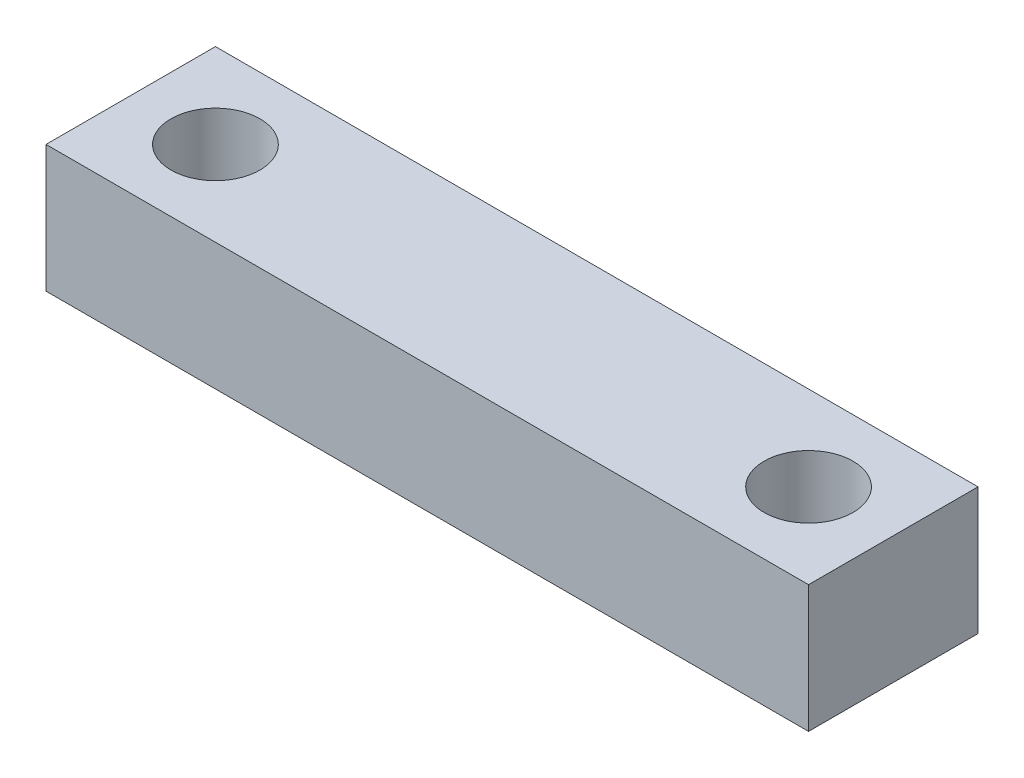
ISO-10303-21;
HEADER;
FILE_DESCRIPTION(('STEP AP214'),'2;1');
FILE_NAME('part.step','',(''),(''),'','','');
FILE_SCHEMA(('AUTOMOTIVE_DESIGN { 1 0 10303 214 1 1 1 1 }'));
ENDSEC;
DATA;
#1=APPLICATION_CONTEXT('core data for automotive mechanical design processes');
#2=APPLICATION_PROTOCOL_DEFINITION('international standard','automotive_design',2000,#1);
#3=PRODUCT_CONTEXT('',#1,'mechanical');
#4=PRODUCT('Part','Part','',(#3));
#5=PRODUCT_RELATED_PRODUCT_CATEGORY('part','',(#4));
#6=PRODUCT_DEFINITION_FORMATION('','',#4);
#7=PRODUCT_DEFINITION_CONTEXT('part definition',#1,'design');
#8=PRODUCT_DEFINITION('design','',#6,#7);
#9=PRODUCT_DEFINITION_SHAPE('','',#8);
#10=(LENGTH_UNIT() NAMED_UNIT(*) SI_UNIT(.MILLI.,.METRE.));
#11=(NAMED_UNIT(*) PLANE_ANGLE_UNIT() SI_UNIT($,.RADIAN.));
#12=(NAMED_UNIT(*) SI_UNIT($,.STERADIAN.) SOLID_ANGLE_UNIT());
#13=UNCERTAINTY_MEASURE_WITH_UNIT(LENGTH_MEASURE(1.E-05),#10,'distance_accuracy_value','');
#14=(GEOMETRIC_REPRESENTATION_CONTEXT(3) GLOBAL_UNCERTAINTY_ASSIGNED_CONTEXT((#13)) GLOBAL_UNIT_ASSIGNED_CONTEXT((#10,
#11,#12)) REPRESENTATION_CONTEXT('',''));
#15=CARTESIAN_POINT('',(0.,0.,0.));
#16=DIRECTION('',(0.,0.,1.));
#17=DIRECTION('',(1.,0.,0.));
#18=AXIS2_PLACEMENT_3D('',#15,#16,#17);
#19=CARTESIAN_POINT('',(0.,6.,0.));
#20=DIRECTION('',(0.,1.,0.));
#21=DIRECTION('',(0.,0.,1.));
#22=AXIS2_PLACEMENT_3D('',#19,#20,#21);
#23=PLANE('',#22);
#24=CARTESIAN_POINT('',(32.,6.,4.));
#25=DIRECTION('',(0.,1.,0.));
#26=DIRECTION('',(0.,0.,-1.));
#27=AXIS2_PLACEMENT_3D('',#24,#25,#26);
#28=CIRCLE('',#27,2.1);
#29=CARTESIAN_POINT('',(32.,6.,1.9));
#30=VERTEX_POINT('',#29);
#31=EDGE_CURVE('E112',#30,#30,#28,.T.);
#32=ORIENTED_EDGE('',*,*,#31,.F.);
#33=EDGE_LOOP('',(#32));
#34=FACE_BOUND('',#33,.T.);
#35=DIRECTION('',(0.,0.,1.));
#36=VECTOR('',#35,1.);
#37=CARTESIAN_POINT('',(0.,6.,0.));
#38=LINE('',#37,#36);
#39=CARTESIAN_POINT('',(0.,6.,0.));
#40=VERTEX_POINT('',#39);
#41=CARTESIAN_POINT('',(0.,6.,8.));
#42=VERTEX_POINT('',#41);
#43=EDGE_CURVE('E92',#40,#42,#38,.T.);
#44=ORIENTED_EDGE('',*,*,#43,.T.);
#45=DIRECTION('',(1.,0.,0.));
#46=VECTOR('',#45,1.);
#47=CARTESIAN_POINT('',(0.,6.,8.));
#48=LINE('',#47,#46);
#49=CARTESIAN_POINT('',(36.,6.,7.99999999999999));
#50=VERTEX_POINT('',#49);
#51=EDGE_CURVE('E87',#42,#50,#48,.T.);
#52=ORIENTED_EDGE('',*,*,#51,.T.);
#53=DIRECTION('',(0.,0.,-1.));
#54=VECTOR('',#53,1.);
#55=CARTESIAN_POINT('',(36.,6.,0.));
#56=LINE('',#55,#54);
#57=CARTESIAN_POINT('',(36.,6.,0.));
#58=VERTEX_POINT('',#57);
#59=EDGE_CURVE('E90',#50,#58,#56,.T.);
#60=ORIENTED_EDGE('',*,*,#59,.T.);
#61=DIRECTION('',(-1.,0.,0.));
#62=VECTOR('',#61,1.);
#63=CARTESIAN_POINT('',(0.,6.,0.));
#64=LINE('',#63,#62);
#65=EDGE_CURVE('E57',#58,#40,#64,.T.);
#66=ORIENTED_EDGE('',*,*,#65,.T.);
#67=EDGE_LOOP('',(#44,#52,#60,#66));
#68=FACE_BOUND('',#67,.T.);
#69=CARTESIAN_POINT('',(4.,6.,4.));
#70=DIRECTION('',(0.,1.,0.));
#71=DIRECTION('',(0.,0.,1.));
#72=AXIS2_PLACEMENT_3D('',#69,#70,#71);
#73=CIRCLE('',#72,2.1);
#74=CARTESIAN_POINT('',(4.,6.,6.1));
#75=VERTEX_POINT('',#74);
#76=EDGE_CURVE('E134',#75,#75,#73,.T.);
#77=ORIENTED_EDGE('',*,*,#76,.F.);
#78=EDGE_LOOP('',(#77));
#79=FACE_BOUND('',#78,.T.);
#80=ADVANCED_FACE('F39',(#34,#68,#79),#23,.T.);
#81=CARTESIAN_POINT('',(0.,0.,0.));
#82=DIRECTION('',(0.,1.,0.));
#83=DIRECTION('',(0.,0.,1.));
#84=AXIS2_PLACEMENT_3D('',#81,#82,#83);
#85=PLANE('',#84);
#86=DIRECTION('',(0.,0.,1.));
#87=VECTOR('',#86,1.);
#88=CARTESIAN_POINT('',(0.,0.,0.));
#89=LINE('',#88,#87);
#90=CARTESIAN_POINT('',(0.,0.,0.));
#91=VERTEX_POINT('',#90);
#92=CARTESIAN_POINT('',(0.,0.,8.));
#93=VERTEX_POINT('',#92);
#94=EDGE_CURVE('E108',#91,#93,#89,.T.);
#95=ORIENTED_EDGE('',*,*,#94,.F.);
#96=DIRECTION('',(-1.,0.,0.));
#97=VECTOR('',#96,1.);
#98=CARTESIAN_POINT('',(0.,0.,0.));
#99=LINE('',#98,#97);
#100=CARTESIAN_POINT('',(36.,0.,0.));
#101=VERTEX_POINT('',#100);
#102=EDGE_CURVE('E80',#101,#91,#99,.T.);
#103=ORIENTED_EDGE('',*,*,#102,.F.);
#104=DIRECTION('',(0.,0.,-1.));
#105=VECTOR('',#104,1.);
#106=CARTESIAN_POINT('',(36.,0.,0.));
#107=LINE('',#106,#105);
#108=CARTESIAN_POINT('',(36.,0.,7.99999999999999));
#109=VERTEX_POINT('',#108);
#110=EDGE_CURVE('E74',#109,#101,#107,.T.);
#111=ORIENTED_EDGE('',*,*,#110,.F.);
#112=DIRECTION('',(1.,0.,0.));
#113=VECTOR('',#112,1.);
#114=CARTESIAN_POINT('',(0.,0.,8.));
#115=LINE('',#114,#113);
#116=EDGE_CURVE('E97',#93,#109,#115,.T.);
#117=ORIENTED_EDGE('',*,*,#116,.F.);
#118=EDGE_LOOP('',(#95,#103,#111,#117));
#119=FACE_BOUND('',#118,.T.);
#120=CARTESIAN_POINT('',(32.,0.,4.));
#121=DIRECTION('',(0.,1.,0.));
#122=DIRECTION('',(0.,0.,-1.));
#123=AXIS2_PLACEMENT_3D('',#120,#121,#122);
#124=CIRCLE('',#123,2.1);
#125=CARTESIAN_POINT('',(32.,0.,1.9));
#126=VERTEX_POINT('',#125);
#127=EDGE_CURVE('E130',#126,#126,#124,.T.);
#128=ORIENTED_EDGE('',*,*,#127,.T.);
#129=EDGE_LOOP('',(#128));
#130=FACE_BOUND('',#129,.T.);
#131=CARTESIAN_POINT('',(4.,0.,4.));
#132=DIRECTION('',(0.,1.,0.));
#133=DIRECTION('',(0.,0.,1.));
#134=AXIS2_PLACEMENT_3D('',#131,#132,#133);
#135=CIRCLE('',#134,2.1);
#136=CARTESIAN_POINT('',(4.,0.,6.1));
#137=VERTEX_POINT('',#136);
#138=EDGE_CURVE('E138',#137,#137,#135,.T.);
#139=ORIENTED_EDGE('',*,*,#138,.T.);
#140=EDGE_LOOP('',(#139));
#141=FACE_BOUND('',#140,.T.);
#142=ADVANCED_FACE('F125',(#119,#130,#141),#85,.F.);
#143=CARTESIAN_POINT('',(0.,6.,0.));
#144=DIRECTION('',(1.,0.,0.));
#145=DIRECTION('',(0.,0.,-1.));
#146=AXIS2_PLACEMENT_3D('',#143,#144,#145);
#147=PLANE('',#146);
#148=ORIENTED_EDGE('',*,*,#94,.T.);
#149=DIRECTION('',(0.,-1.,0.));
#150=VECTOR('',#149,1.);
#151=CARTESIAN_POINT('',(0.,6.,8.));
#152=LINE('',#151,#150);
#153=EDGE_CURVE('E11',#42,#93,#152,.T.);
#154=ORIENTED_EDGE('',*,*,#153,.F.);
#155=ORIENTED_EDGE('',*,*,#43,.F.);
#156=DIRECTION('',(0.,-1.,0.));
#157=VECTOR('',#156,1.);
#158=CARTESIAN_POINT('',(0.,6.,0.));
#159=LINE('',#158,#157);
#160=EDGE_CURVE('E104',#40,#91,#159,.T.);
#161=ORIENTED_EDGE('',*,*,#160,.T.);
#162=EDGE_LOOP('',(#148,#154,#155,#161));
#163=FACE_BOUND('',#162,.T.);
#164=ADVANCED_FACE('F41',(#163),#147,.F.);
#165=CARTESIAN_POINT('',(0.,6.,8.));
#166=DIRECTION('',(0.,0.,-1.));
#167=DIRECTION('',(-1.,0.,0.));
#168=AXIS2_PLACEMENT_3D('',#165,#166,#167);
#169=PLANE('',#168);
#170=ORIENTED_EDGE('',*,*,#116,.T.);
#171=DIRECTION('',(0.,-1.,0.));
#172=VECTOR('',#171,1.);
#173=CARTESIAN_POINT('',(36.,6.,7.99999999999999));
#174=LINE('',#173,#172);
#175=EDGE_CURVE('E49',#50,#109,#174,.T.);
#176=ORIENTED_EDGE('',*,*,#175,.F.);
#177=ORIENTED_EDGE('',*,*,#51,.F.);
#178=ORIENTED_EDGE('',*,*,#153,.T.);
#179=EDGE_LOOP('',(#170,#176,#177,#178));
#180=FACE_BOUND('',#179,.T.);
#181=ADVANCED_FACE('F96',(#180),#169,.F.);
#182=CARTESIAN_POINT('',(36.,6.,0.));
#183=DIRECTION('',(-1.,0.,0.));
#184=DIRECTION('',(0.,0.,1.));
#185=AXIS2_PLACEMENT_3D('',#182,#183,#184);
#186=PLANE('',#185);
#187=ORIENTED_EDGE('',*,*,#110,.T.);
#188=DIRECTION('',(0.,-1.,0.));
#189=VECTOR('',#188,1.);
#190=CARTESIAN_POINT('',(36.,6.,0.));
#191=LINE('',#190,#189);
#192=EDGE_CURVE('E99',#58,#101,#191,.T.);
#193=ORIENTED_EDGE('',*,*,#192,.F.);
#194=ORIENTED_EDGE('',*,*,#59,.F.);
#195=ORIENTED_EDGE('',*,*,#175,.T.);
#196=EDGE_LOOP('',(#187,#193,#194,#195));
#197=FACE_BOUND('',#196,.T.);
#198=ADVANCED_FACE('F100',(#197),#186,.F.);
#199=CARTESIAN_POINT('',(0.,6.,0.));
#200=DIRECTION('',(0.,0.,1.));
#201=DIRECTION('',(1.,0.,0.));
#202=AXIS2_PLACEMENT_3D('',#199,#200,#201);
#203=PLANE('',#202);
#204=ORIENTED_EDGE('',*,*,#102,.T.);
#205=ORIENTED_EDGE('',*,*,#160,.F.);
#206=ORIENTED_EDGE('',*,*,#65,.F.);
#207=ORIENTED_EDGE('',*,*,#192,.T.);
#208=EDGE_LOOP('',(#204,#205,#206,#207));
#209=FACE_BOUND('',#208,.T.);
#210=ADVANCED_FACE('F122',(#209),#203,.F.);
#211=CARTESIAN_POINT('',(32.,6.,4.));
#212=DIRECTION('',(0.,-1.,0.));
#213=DIRECTION('',(0.,0.,-1.));
#214=AXIS2_PLACEMENT_3D('',#211,#212,#213);
#215=CYLINDRICAL_SURFACE('',#214,2.1);
#216=ORIENTED_EDGE('',*,*,#31,.T.);
#217=EDGE_LOOP('',(#216));
#218=FACE_BOUND('',#217,.T.);
#219=ORIENTED_EDGE('',*,*,#127,.F.);
#220=EDGE_LOOP('',(#219));
#221=FACE_BOUND('',#220,.T.);
#222=ADVANCED_FACE('F157',(#218,#221),#215,.F.);
#223=CARTESIAN_POINT('',(4.,6.,4.));
#224=DIRECTION('',(0.,-1.,0.));
#225=DIRECTION('',(0.,0.,-1.));
#226=AXIS2_PLACEMENT_3D('',#223,#224,#225);
#227=CYLINDRICAL_SURFACE('',#226,2.1);
#228=ORIENTED_EDGE('',*,*,#76,.T.);
#229=EDGE_LOOP('',(#228));
#230=FACE_BOUND('',#229,.T.);
#231=ORIENTED_EDGE('',*,*,#138,.F.);
#232=EDGE_LOOP('',(#231));
#233=FACE_BOUND('',#232,.T.);
#234=ADVANCED_FACE('F146',(#230,#233),#227,.F.);
#235=CLOSED_SHELL('',(#80,#142,#164,#181,#198,#210,#222,#234));
#236=MANIFOLD_SOLID_BREP('B2',#235);
#237=ADVANCED_BREP_SHAPE_REPRESENTATION('',(#18,#236),#14);
#238=SHAPE_DEFINITION_REPRESENTATION(#9,#237);
ENDSEC;
END-ISO-10303-21;
